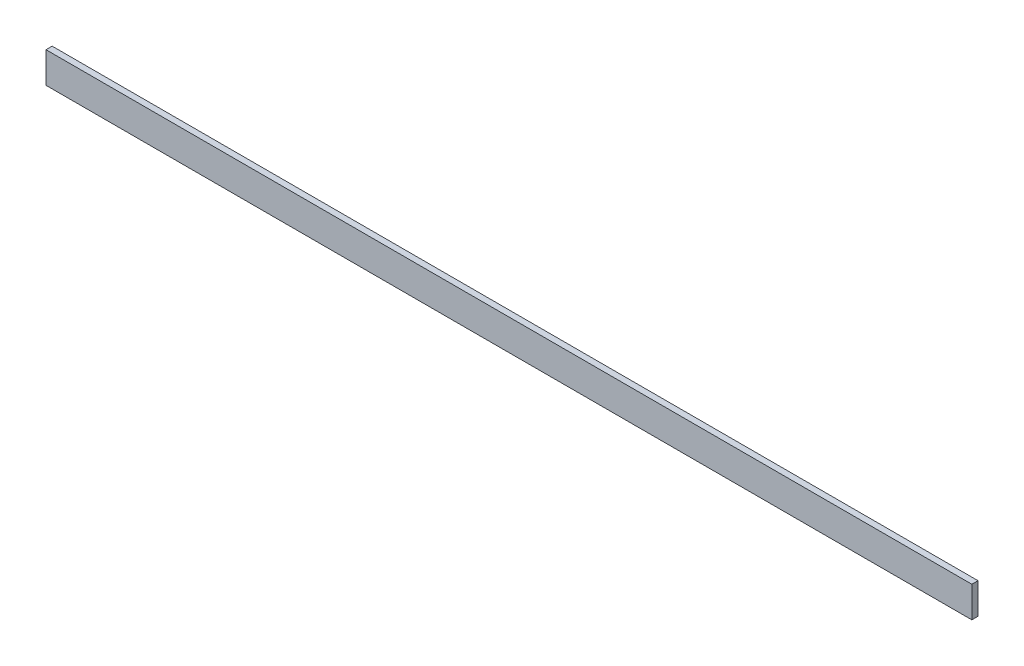
ISO-10303-21;
HEADER;
FILE_DESCRIPTION(('STEP AP214'),'2;1');
FILE_NAME('part.step','',(''),(''),'','','');
FILE_SCHEMA(('AUTOMOTIVE_DESIGN { 1 0 10303 214 1 1 1 1 }'));
ENDSEC;
DATA;
#1=APPLICATION_CONTEXT('core data for automotive mechanical design processes');
#2=APPLICATION_PROTOCOL_DEFINITION('international standard','automotive_design',2000,#1);
#3=PRODUCT_CONTEXT('',#1,'mechanical');
#4=PRODUCT('Part','Part','',(#3));
#5=PRODUCT_RELATED_PRODUCT_CATEGORY('part','',(#4));
#6=PRODUCT_DEFINITION_FORMATION('','',#4);
#7=PRODUCT_DEFINITION_CONTEXT('part definition',#1,'design');
#8=PRODUCT_DEFINITION('design','',#6,#7);
#9=PRODUCT_DEFINITION_SHAPE('','',#8);
#10=(LENGTH_UNIT() NAMED_UNIT(*) SI_UNIT(.MILLI.,.METRE.));
#11=(NAMED_UNIT(*) PLANE_ANGLE_UNIT() SI_UNIT($,.RADIAN.));
#12=(NAMED_UNIT(*) SI_UNIT($,.STERADIAN.) SOLID_ANGLE_UNIT());
#13=UNCERTAINTY_MEASURE_WITH_UNIT(LENGTH_MEASURE(1.E-05),#10,'distance_accuracy_value','');
#14=(GEOMETRIC_REPRESENTATION_CONTEXT(3) GLOBAL_UNCERTAINTY_ASSIGNED_CONTEXT((#13)) GLOBAL_UNIT_ASSIGNED_CONTEXT((#10,
#11,#12)) REPRESENTATION_CONTEXT('',''));
#15=CARTESIAN_POINT('',(0.,0.,0.));
#16=DIRECTION('',(0.,0.,1.));
#17=DIRECTION('',(1.,0.,0.));
#18=AXIS2_PLACEMENT_3D('',#15,#16,#17);
#19=CARTESIAN_POINT('',(150.,-5.,2.));
#20=DIRECTION('',(-1.,0.,0.));
#21=DIRECTION('',(0.,0.,1.));
#22=AXIS2_PLACEMENT_3D('',#19,#20,#21);
#23=PLANE('',#22);
#24=DIRECTION('',(0.,1.,0.));
#25=VECTOR('',#24,1.);
#26=CARTESIAN_POINT('',(150.,-5.,0.));
#27=LINE('',#26,#25);
#28=CARTESIAN_POINT('',(150.,-5.,0.));
#29=VERTEX_POINT('',#28);
#30=CARTESIAN_POINT('',(150.,5.,0.));
#31=VERTEX_POINT('',#30);
#32=EDGE_CURVE('E96',#29,#31,#27,.T.);
#33=ORIENTED_EDGE('',*,*,#32,.T.);
#34=DIRECTION('',(0.,0.,-1.));
#35=VECTOR('',#34,1.);
#36=CARTESIAN_POINT('',(150.,5.,2.));
#37=LINE('',#36,#35);
#38=CARTESIAN_POINT('',(150.,5.,2.));
#39=VERTEX_POINT('',#38);
#40=EDGE_CURVE('E11',#39,#31,#37,.T.);
#41=ORIENTED_EDGE('',*,*,#40,.F.);
#42=DIRECTION('',(0.,1.,0.));
#43=VECTOR('',#42,1.);
#44=CARTESIAN_POINT('',(150.,-5.,2.));
#45=LINE('',#44,#43);
#46=CARTESIAN_POINT('',(150.,-5.,2.));
#47=VERTEX_POINT('',#46);
#48=EDGE_CURVE('E84',#47,#39,#45,.T.);
#49=ORIENTED_EDGE('',*,*,#48,.F.);
#50=DIRECTION('',(0.,0.,-1.));
#51=VECTOR('',#50,1.);
#52=CARTESIAN_POINT('',(150.,-5.,2.));
#53=LINE('',#52,#51);
#54=EDGE_CURVE('E92',#47,#29,#53,.T.);
#55=ORIENTED_EDGE('',*,*,#54,.T.);
#56=EDGE_LOOP('',(#33,#41,#49,#55));
#57=FACE_BOUND('',#56,.T.);
#58=ADVANCED_FACE('F33',(#57),#23,.F.);
#59=CARTESIAN_POINT('',(-150.,5.,2.));
#60=DIRECTION('',(0.,-1.,0.));
#61=DIRECTION('',(0.,0.,-1.));
#62=AXIS2_PLACEMENT_3D('',#59,#60,#61);
#63=PLANE('',#62);
#64=DIRECTION('',(-1.,0.,0.));
#65=VECTOR('',#64,1.);
#66=CARTESIAN_POINT('',(-150.,5.,0.));
#67=LINE('',#66,#65);
#68=CARTESIAN_POINT('',(-150.,5.,0.));
#69=VERTEX_POINT('',#68);
#70=EDGE_CURVE('E88',#31,#69,#67,.T.);
#71=ORIENTED_EDGE('',*,*,#70,.T.);
#72=DIRECTION('',(0.,0.,-1.));
#73=VECTOR('',#72,1.);
#74=CARTESIAN_POINT('',(-150.,5.,2.));
#75=LINE('',#74,#73);
#76=CARTESIAN_POINT('',(-150.,5.,2.));
#77=VERTEX_POINT('',#76);
#78=EDGE_CURVE('E41',#77,#69,#75,.T.);
#79=ORIENTED_EDGE('',*,*,#78,.F.);
#80=DIRECTION('',(-1.,0.,0.));
#81=VECTOR('',#80,1.);
#82=CARTESIAN_POINT('',(-150.,5.,2.));
#83=LINE('',#82,#81);
#84=EDGE_CURVE('E79',#39,#77,#83,.T.);
#85=ORIENTED_EDGE('',*,*,#84,.F.);
#86=ORIENTED_EDGE('',*,*,#40,.T.);
#87=EDGE_LOOP('',(#71,#79,#85,#86));
#88=FACE_BOUND('',#87,.T.);
#89=ADVANCED_FACE('F87',(#88),#63,.F.);
#90=CARTESIAN_POINT('',(-150.,-5.,2.));
#91=DIRECTION('',(1.,0.,0.));
#92=DIRECTION('',(0.,0.,-1.));
#93=AXIS2_PLACEMENT_3D('',#90,#91,#92);
#94=PLANE('',#93);
#95=DIRECTION('',(0.,-1.,0.));
#96=VECTOR('',#95,1.);
#97=CARTESIAN_POINT('',(-150.,-5.,0.));
#98=LINE('',#97,#96);
#99=CARTESIAN_POINT('',(-150.,-5.,0.));
#100=VERTEX_POINT('',#99);
#101=EDGE_CURVE('E66',#69,#100,#98,.T.);
#102=ORIENTED_EDGE('',*,*,#101,.T.);
#103=DIRECTION('',(0.,0.,-1.));
#104=VECTOR('',#103,1.);
#105=CARTESIAN_POINT('',(-150.,-5.,2.));
#106=LINE('',#105,#104);
#107=CARTESIAN_POINT('',(-150.,-5.,2.));
#108=VERTEX_POINT('',#107);
#109=EDGE_CURVE('E89',#108,#100,#106,.T.);
#110=ORIENTED_EDGE('',*,*,#109,.F.);
#111=DIRECTION('',(0.,-1.,0.));
#112=VECTOR('',#111,1.);
#113=CARTESIAN_POINT('',(-150.,-5.,2.));
#114=LINE('',#113,#112);
#115=EDGE_CURVE('E82',#77,#108,#114,.T.);
#116=ORIENTED_EDGE('',*,*,#115,.F.);
#117=ORIENTED_EDGE('',*,*,#78,.T.);
#118=EDGE_LOOP('',(#102,#110,#116,#117));
#119=FACE_BOUND('',#118,.T.);
#120=ADVANCED_FACE('F90',(#119),#94,.F.);
#121=CARTESIAN_POINT('',(-150.,-5.,2.));
#122=DIRECTION('',(0.,1.,0.));
#123=DIRECTION('',(0.,0.,1.));
#124=AXIS2_PLACEMENT_3D('',#121,#122,#123);
#125=PLANE('',#124);
#126=DIRECTION('',(1.,0.,0.));
#127=VECTOR('',#126,1.);
#128=CARTESIAN_POINT('',(-150.,-5.,0.));
#129=LINE('',#128,#127);
#130=EDGE_CURVE('E72',#100,#29,#129,.T.);
#131=ORIENTED_EDGE('',*,*,#130,.T.);
#132=ORIENTED_EDGE('',*,*,#54,.F.);
#133=DIRECTION('',(1.,0.,0.));
#134=VECTOR('',#133,1.);
#135=CARTESIAN_POINT('',(-150.,-5.,2.));
#136=LINE('',#135,#134);
#137=EDGE_CURVE('E49',#108,#47,#136,.T.);
#138=ORIENTED_EDGE('',*,*,#137,.F.);
#139=ORIENTED_EDGE('',*,*,#109,.T.);
#140=EDGE_LOOP('',(#131,#132,#138,#139));
#141=FACE_BOUND('',#140,.T.);
#142=ADVANCED_FACE('F103',(#141),#125,.F.);
#143=CARTESIAN_POINT('',(0.,0.,2.));
#144=DIRECTION('',(0.,0.,-1.));
#145=DIRECTION('',(-1.,0.,0.));
#146=AXIS2_PLACEMENT_3D('',#143,#144,#145);
#147=PLANE('',#146);
#148=ORIENTED_EDGE('',*,*,#48,.T.);
#149=ORIENTED_EDGE('',*,*,#84,.T.);
#150=ORIENTED_EDGE('',*,*,#115,.T.);
#151=ORIENTED_EDGE('',*,*,#137,.T.);
#152=EDGE_LOOP('',(#148,#149,#150,#151));
#153=FACE_BOUND('',#152,.T.);
#154=ADVANCED_FACE('F80',(#153),#147,.F.);
#155=CARTESIAN_POINT('',(0.,0.,0.));
#156=DIRECTION('',(0.,0.,-1.));
#157=DIRECTION('',(-1.,0.,0.));
#158=AXIS2_PLACEMENT_3D('',#155,#156,#157);
#159=PLANE('',#158);
#160=ORIENTED_EDGE('',*,*,#32,.F.);
#161=ORIENTED_EDGE('',*,*,#130,.F.);
#162=ORIENTED_EDGE('',*,*,#101,.F.);
#163=ORIENTED_EDGE('',*,*,#70,.F.);
#164=EDGE_LOOP('',(#160,#161,#162,#163));
#165=FACE_BOUND('',#164,.T.);
#166=ADVANCED_FACE('F106',(#165),#159,.T.);
#167=CLOSED_SHELL('',(#58,#89,#120,#142,#154,#166));
#168=MANIFOLD_SOLID_BREP('B2',#167);
#169=ADVANCED_BREP_SHAPE_REPRESENTATION('',(#18,#168),#14);
#170=SHAPE_DEFINITION_REPRESENTATION(#9,#169);
ENDSEC;
END-ISO-10303-21;
